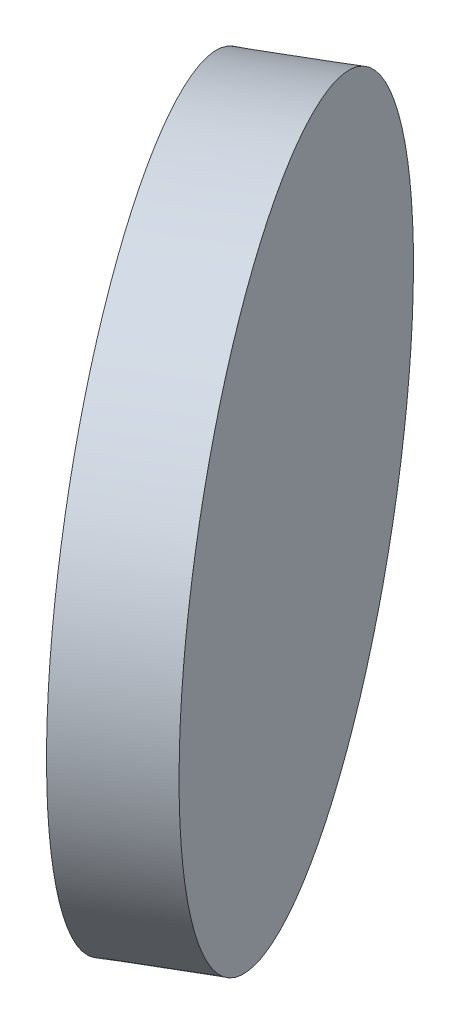
ISO-10303-21;
HEADER;
FILE_DESCRIPTION(('STEP AP214'),'2;1');
FILE_NAME('part.step','',(''),(''),'','','');
FILE_SCHEMA(('AUTOMOTIVE_DESIGN { 1 0 10303 214 1 1 1 1 }'));
ENDSEC;
DATA;
#1=APPLICATION_CONTEXT('core data for automotive mechanical design processes');
#2=APPLICATION_PROTOCOL_DEFINITION('international standard','automotive_design',2000,#1);
#3=PRODUCT_CONTEXT('',#1,'mechanical');
#4=PRODUCT('Part','Part','',(#3));
#5=PRODUCT_RELATED_PRODUCT_CATEGORY('part','',(#4));
#6=PRODUCT_DEFINITION_FORMATION('','',#4);
#7=PRODUCT_DEFINITION_CONTEXT('part definition',#1,'design');
#8=PRODUCT_DEFINITION('design','',#6,#7);
#9=PRODUCT_DEFINITION_SHAPE('','',#8);
#10=(LENGTH_UNIT() NAMED_UNIT(*) SI_UNIT(.MILLI.,.METRE.));
#11=(NAMED_UNIT(*) PLANE_ANGLE_UNIT() SI_UNIT($,.RADIAN.));
#12=(NAMED_UNIT(*) SI_UNIT($,.STERADIAN.) SOLID_ANGLE_UNIT());
#13=UNCERTAINTY_MEASURE_WITH_UNIT(LENGTH_MEASURE(1.E-05),#10,'distance_accuracy_value','');
#14=(GEOMETRIC_REPRESENTATION_CONTEXT(3) GLOBAL_UNCERTAINTY_ASSIGNED_CONTEXT((#13)) GLOBAL_UNIT_ASSIGNED_CONTEXT((#10,
#11,#12)) REPRESENTATION_CONTEXT('',''));
#15=CARTESIAN_POINT('',(0.,0.,0.));
#16=DIRECTION('',(0.,0.,1.));
#17=DIRECTION('',(1.,0.,0.));
#18=AXIS2_PLACEMENT_3D('',#15,#16,#17);
#19=CARTESIAN_POINT('',(145.810327838397,186.949261113837,104.208691892853));
#20=CARTESIAN_POINT('',(145.810327838397,187.314390039411,104.208691892853));
#21=CARTESIAN_POINT('',(145.846586216857,188.04464789056,104.270807986674));
#22=CARTESIAN_POINT('',(146.0076588362,189.097939567754,104.546749778892));
#23=CARTESIAN_POINT('',(146.269226576766,190.068658736957,104.994854934272));
#24=CARTESIAN_POINT('',(146.621237536975,190.919501204881,105.597903022993));
#25=CARTESIAN_POINT('',(147.050164133034,191.617769572643,106.332719245199));
#26=CARTESIAN_POINT('',(147.539522956403,192.136629778463,107.17106502556));
#27=CARTESIAN_POINT('',(148.070508221934,192.456142315611,108.080723205886));
#28=CARTESIAN_POINT('',(148.622714463654,192.564028496469,109.02673613245));
#29=CARTESIAN_POINT('',(149.174920705374,192.456142315611,109.972749059014));
#30=CARTESIAN_POINT('',(149.705905970905,192.136629778463,110.88240723934));
#31=CARTESIAN_POINT('',(150.195264794274,191.617769572643,111.720753019701));
#32=CARTESIAN_POINT('',(150.624191390333,190.919501204881,112.455569241907));
#33=CARTESIAN_POINT('',(150.976202350542,190.068658736957,113.058617330628));
#34=CARTESIAN_POINT('',(151.237770091108,189.097939567754,113.506722486008));
#35=CARTESIAN_POINT('',(151.398842710451,188.04464789056,113.782664278226));
#36=CARTESIAN_POINT('',(151.453230278141,186.949261113837,113.875838418958));
#37=CARTESIAN_POINT('',(151.398842710451,185.853874337113,113.782664278226));
#38=CARTESIAN_POINT('',(151.237770091108,184.800582659919,113.506722486008));
#39=CARTESIAN_POINT('',(150.976202350542,183.829863490717,113.058617330628));
#40=CARTESIAN_POINT('',(150.624191390334,182.979021022792,112.455569241907));
#41=CARTESIAN_POINT('',(150.195264794274,182.28075265503,111.720753019701));
#42=CARTESIAN_POINT('',(149.705905970906,181.761892449211,110.88240723934));
#43=CARTESIAN_POINT('',(149.174920705374,181.442379912062,109.972749059014));
#44=CARTESIAN_POINT('',(148.622714463654,181.334493731204,109.02673613245));
#45=CARTESIAN_POINT('',(148.070508221934,181.442379912062,108.080723205886));
#46=CARTESIAN_POINT('',(147.539522956403,181.76189244921,107.17106502556));
#47=CARTESIAN_POINT('',(147.050164133034,182.28075265503,106.332719245199));
#48=CARTESIAN_POINT('',(146.621237536975,182.979021022792,105.597903022993));
#49=CARTESIAN_POINT('',(146.269226576767,183.829863490717,104.994854934272));
#50=CARTESIAN_POINT('',(146.0076588362,184.800582659919,104.546749778892));
#51=CARTESIAN_POINT('',(145.846586216857,185.853874337113,104.270807986674));
#52=CARTESIAN_POINT('',(145.810327838397,186.584132188262,104.208691892853));
#53=CARTESIAN_POINT('',(145.810327838397,186.949261113837,104.208691892853));
#54=B_SPLINE_CURVE_WITH_KNOTS('',3,(#19,#20,#21,#22,#23,#24,#25,#26,#27,#28,#29,#30,#31,#32,#33,
#34,#35,#36,#37,#38,#39,#40,#41,#42,#43,#44,#45,#46,#47,#48,#49,#50,#51,#52,#53),.UNSPECIFIED.,
.T.,.F.,(4,1,1,1,1,1,1,1,1,1,1,1,1,1,1,1,1,1,1,1,1,1,1,1,1,1,1,1,1,1,1,1,4),(0.,
0.0312499999999999,0.0624999999999998,0.0937500000000001,0.125,0.15625,0.1875,0.21875,0.25,
0.28125,0.3125,0.34375,0.375000000000001,0.40625,0.4375,0.46875,0.5,0.53125,0.5625,0.59375,
0.625,0.65625,0.6875,0.71875,0.75,0.78125,0.8125,0.84375,0.875,0.90625,0.9375,0.96875,1.),.UNSPECIFIED.);
#55=DIRECTION('',(0.863633692378211,0.,-0.504119872043523));
#56=VECTOR('',#55,1.);
#57=SURFACE_OF_LINEAR_EXTRUSION('',#54,#56);
#58=CARTESIAN_POINT('',(145.810327838397,186.949261113837,104.208691892853));
#59=CARTESIAN_POINT('',(145.810327840195,187.022287191381,104.208691895933));
#60=CARTESIAN_POINT('',(145.811053011605,187.095312949708,104.20993422439));
#61=CARTESIAN_POINT('',(145.813948106546,187.24125221387,104.2148939605));
#62=CARTESIAN_POINT('',(145.816118039557,187.314165718966,104.218611384395));
#63=CARTESIAN_POINT('',(145.821897080213,187.459768147386,104.228511756305));
#64=CARTESIAN_POINT('',(145.825506192723,187.532457069951,104.234694712654));
#65=CARTESIAN_POINT('',(145.834158032156,187.677498197483,104.249516623969));
#66=CARTESIAN_POINT('',(145.839200754233,187.749850403589,104.258155570632));
#67=CARTESIAN_POINT('',(145.850714263807,187.894105963232,104.277879956313));
#68=CARTESIAN_POINT('',(145.857185041933,187.966009319711,104.288965379276));
#69=CARTESIAN_POINT('',(145.871549075666,188.109254761566,104.313573144567));
#70=CARTESIAN_POINT('',(145.879442331272,188.180596846942,104.327095486896));
#71=CARTESIAN_POINT('',(145.896634775725,188.32261164732,104.356548748128));
#72=CARTESIAN_POINT('',(145.905933973796,188.393284357928,104.372479682837));
#73=CARTESIAN_POINT('',(145.925921808813,188.533852608526,104.406721871481));
#74=CARTESIAN_POINT('',(145.936610450454,188.603748145888,104.425033133463));
#75=CARTESIAN_POINT('',(145.959360684517,188.742654163727,104.464007730053));
#76=CARTESIAN_POINT('',(145.971422272297,188.811664647194,104.48467105671));
#77=CARTESIAN_POINT('',(145.996901929596,188.948692739563,104.52832156869));
#78=CARTESIAN_POINT('',(146.010319990214,189.016710354977,104.551308738763));
#79=CARTESIAN_POINT('',(146.038496055928,189.151644611201,104.599578606742));
#80=CARTESIAN_POINT('',(146.053254061024,189.21856125201,104.624861304649));
#81=CARTESIAN_POINT('',(146.084083158025,189.351193940435,104.677676217037));
#82=CARTESIAN_POINT('',(146.100154258544,189.416909980168,104.705208446278));
#83=CARTESIAN_POINT('',(146.133582766889,189.547042120442,104.762476543994));
#84=CARTESIAN_POINT('',(146.150940179063,189.611458216587,104.792212419918));
#85=CARTESIAN_POINT('',(146.186914528949,189.738891037255,104.853841929774));
#86=CARTESIAN_POINT('',(146.205531462404,189.801907766507,104.885735556413));
#87=CARTESIAN_POINT('',(146.243998098506,189.926442480764,104.951634730028));
#88=CARTESIAN_POINT('',(146.263847793064,189.9879604756,104.985640263144));
#89=CARTESIAN_POINT('',(146.30475310035,190.109398097887,105.055717249847));
#90=CARTESIAN_POINT('',(146.325808713079,190.169317725339,105.091788703434));
#91=CARTESIAN_POINT('',(146.36908971772,190.287471302111,105.165935619515));
#92=CARTESIAN_POINT('',(146.391315117306,190.345705240368,105.204011095159));
#93=CARTESIAN_POINT('',(146.436899660151,190.460400365108,105.282104321067));
#94=CARTESIAN_POINT('',(146.460258807241,190.516861545599,105.322122077896));
#95=CARTESIAN_POINT('',(146.508074798859,190.627923997273,105.404038113518));
#96=CARTESIAN_POINT('',(146.532531639677,190.682525274743,105.445936385954));
#97=CARTESIAN_POINT('',(146.582507003329,190.789780811656,105.531551752918));
#98=CARTESIAN_POINT('',(146.608025519197,190.842435083872,105.575268835511));
#99=CARTESIAN_POINT('',(146.660088100036,190.945709292502,105.664459921637));
#100=CARTESIAN_POINT('',(146.686632165009,190.996329228916,105.709933925171));
#101=CARTESIAN_POINT('',(146.740701812553,191.095463118341,105.802563420544));
#102=CARTESIAN_POINT('',(146.768227401565,191.143977057532,105.849718923414));
#103=CARTESIAN_POINT('',(146.824216190492,191.238827497418,105.945636198637));
#104=CARTESIAN_POINT('',(146.852679393576,191.285163990751,105.99439797642));
#105=CARTESIAN_POINT('',(146.910499485184,191.375588005698,106.093452550498));
#106=CARTESIAN_POINT('',(146.939856370687,191.419675534913,106.143745341616));
#107=CARTESIAN_POINT('',(146.999419936691,191.505530124348,106.245786751392));
#108=CARTESIAN_POINT('',(147.029626611615,191.547297199793,106.297535360494));
#109=CARTESIAN_POINT('',(147.090845730223,191.628439224845,106.402412982623));
#110=CARTESIAN_POINT('',(147.121858173908,191.667814174452,106.455541995651));
#111=CARTESIAN_POINT('',(147.184638598124,191.744118716756,106.563094370754));
#112=CARTESIAN_POINT('',(147.216406583612,191.781048293404,106.61751774132));
#113=CARTESIAN_POINT('',(147.280648000861,191.852408999223,106.727573018764));
#114=CARTESIAN_POINT('',(147.313121435007,191.886840119947,106.783204929726));
#115=CARTESIAN_POINT('',(147.37872363291,191.953150753982,106.895591430527));
#116=CARTESIAN_POINT('',(147.411852394452,191.985030275918,106.952346016571));
#117=CARTESIAN_POINT('',(147.47871516837,192.046184574152,107.066892075005));
#118=CARTESIAN_POINT('',(147.512449176772,192.075459367539,107.124683540589));
#119=CARTESIAN_POINT('',(147.580472216754,192.131350966496,107.241217310519));
#120=CARTESIAN_POINT('',(147.614761248332,192.157967772064,107.299959614865));
#121=CARTESIAN_POINT('',(147.683839832725,192.208510626477,107.41830169224));
#122=CARTESIAN_POINT('',(147.718629388822,192.232436657663,107.477901470892));
#123=CARTESIAN_POINT('',(147.788654672756,192.27756527751,107.597865387963));
#124=CARTESIAN_POINT('',(147.823890402101,192.298767856963,107.658229528965));
#125=CARTESIAN_POINT('',(147.894753650624,192.338416829609,107.779629006291));
#126=CARTESIAN_POINT('',(147.930381168478,192.356863232117,107.840664340347));
#127=CARTESIAN_POINT('',(148.001973651404,192.390967113763,107.963313106653));
#128=CARTESIAN_POINT('',(148.037938614261,192.406624611201,108.024926535107));
#129=CARTESIAN_POINT('',(148.110151488336,192.435117901258,108.148638125412));
#130=CARTESIAN_POINT('',(148.146399399555,192.447953693877,108.210736287263));
#131=CARTESIAN_POINT('',(148.219121492866,192.470792526848,108.335320247242));
#132=CARTESIAN_POINT('',(148.255595676441,192.480795548612,108.397806047912));
#133=CARTESIAN_POINT('',(148.328713794669,192.497957814934,108.523068458553));
#134=CARTESIAN_POINT('',(148.365357729894,192.50511704988,108.585845069509));
#135=CARTESIAN_POINT('',(148.438758794137,192.516580673352,108.711592209528));
#136=CARTESIAN_POINT('',(148.475515922772,192.520885071528,108.774562737937));
#137=CARTESIAN_POINT('',(148.549086855738,192.526627943541,108.900600888807));
#138=CARTESIAN_POINT('',(148.585900659696,192.528066436183,108.963668510629));
#139=CARTESIAN_POINT('',(148.659528267612,192.528066436183,109.089803754272));
#140=CARTESIAN_POINT('',(148.69634207157,192.526627943541,109.152871376093));
#141=CARTESIAN_POINT('',(148.769913004536,192.520885071529,109.278909526963));
#142=CARTESIAN_POINT('',(148.806670133171,192.516580673352,109.341880055372));
#143=CARTESIAN_POINT('',(148.880071197414,192.50511704988,109.467627195392));
#144=CARTESIAN_POINT('',(148.916715132639,192.497957814934,109.530403806347));
#145=CARTESIAN_POINT('',(148.989833250867,192.480795548612,109.655666216989));
#146=CARTESIAN_POINT('',(149.026307434442,192.470792526848,109.718152017658));
#147=CARTESIAN_POINT('',(149.099029527753,192.447953693877,109.842735977637));
#148=CARTESIAN_POINT('',(149.135277438972,192.435117901258,109.904834139488));
#149=CARTESIAN_POINT('',(149.207490313047,192.406624611201,110.028545729794));
#150=CARTESIAN_POINT('',(149.243455275904,192.390967113763,110.090159158248));
#151=CARTESIAN_POINT('',(149.31504775883,192.356863232117,110.212807924553));
#152=CARTESIAN_POINT('',(149.350675276684,192.338416829609,110.273843258609));
#153=CARTESIAN_POINT('',(149.421538525207,192.298767856963,110.395242735935));
#154=CARTESIAN_POINT('',(149.456774254552,192.27756527751,110.455606876937));
#155=CARTESIAN_POINT('',(149.526799538486,192.232436657663,110.575570794008));
#156=CARTESIAN_POINT('',(149.561589094583,192.208510626477,110.635170572661));
#157=CARTESIAN_POINT('',(149.630667678976,192.157967772064,110.753512650035));
#158=CARTESIAN_POINT('',(149.664956710554,192.131350966496,110.812254954381));
#159=CARTESIAN_POINT('',(149.732979750536,192.075459367539,110.928788724311));
#160=CARTESIAN_POINT('',(149.766713758938,192.046184574152,110.986580189895));
#161=CARTESIAN_POINT('',(149.833576532856,191.985030275918,111.101126248329));
#162=CARTESIAN_POINT('',(149.866705294398,191.953150753982,111.157880834373));
#163=CARTESIAN_POINT('',(149.932307492301,191.886840119947,111.270267335175));
#164=CARTESIAN_POINT('',(149.964780926447,191.852408999223,111.325899246137));
#165=CARTESIAN_POINT('',(150.029022343696,191.781048293404,111.43595452358));
#166=CARTESIAN_POINT('',(150.060790329184,191.744118716756,111.490377894146));
#167=CARTESIAN_POINT('',(150.1235707534,191.667814174452,111.597930269249));
#168=CARTESIAN_POINT('',(150.154583197085,191.628439224845,111.651059282277));
#169=CARTESIAN_POINT('',(150.215802315694,191.547297199793,111.755936904407));
#170=CARTESIAN_POINT('',(150.246008990617,191.505530124348,111.807685513508));
#171=CARTESIAN_POINT('',(150.305572556621,191.419675534913,111.909726923284));
#172=CARTESIAN_POINT('',(150.334929442124,191.375588005698,111.960019714402));
#173=CARTESIAN_POINT('',(150.392749533732,191.285163990751,112.05907428848));
#174=CARTESIAN_POINT('',(150.421212736816,191.238827497418,112.107836066263));
#175=CARTESIAN_POINT('',(150.477201525743,191.143977057532,112.203753341487));
#176=CARTESIAN_POINT('',(150.504727114755,191.095463118341,112.250908844357));
#177=CARTESIAN_POINT('',(150.558796762299,190.996329228916,112.343538339729));
#178=CARTESIAN_POINT('',(150.585340827272,190.945709292502,112.389012343263));
#179=CARTESIAN_POINT('',(150.637403408112,190.842435083872,112.478203429389));
#180=CARTESIAN_POINT('',(150.662921923979,190.789780811656,112.521920511982));
#181=CARTESIAN_POINT('',(150.712897287632,190.682525274743,112.607535878946));
#182=CARTESIAN_POINT('',(150.737354128449,190.627923997273,112.649434151382));
#183=CARTESIAN_POINT('',(150.785170120067,190.516861545599,112.731350187004));
#184=CARTESIAN_POINT('',(150.808529267157,190.460400365108,112.771367943833));
#185=CARTESIAN_POINT('',(150.854113810002,190.345705240368,112.849461169741));
#186=CARTESIAN_POINT('',(150.876339209589,190.287471302111,112.887536645385));
#187=CARTESIAN_POINT('',(150.919620214229,190.169317725339,112.961683561467));
#188=CARTESIAN_POINT('',(150.940675826958,190.109398097887,112.997755015053));
#189=CARTESIAN_POINT('',(150.981581134245,189.9879604756,113.067832001756));
#190=CARTESIAN_POINT('',(151.001430828802,189.926442480764,113.101837534872));
#191=CARTESIAN_POINT('',(151.039897464905,189.801907766507,113.167736708487));
#192=CARTESIAN_POINT('',(151.058514398359,189.738891037255,113.199630335126));
#193=CARTESIAN_POINT('',(151.094488748245,189.611458216587,113.261259844983));
#194=CARTESIAN_POINT('',(151.111846160419,189.547042120442,113.290995720906));
#195=CARTESIAN_POINT('',(151.145274668764,189.416909980168,113.348263818622));
#196=CARTESIAN_POINT('',(151.161345769284,189.351193940435,113.375796047863));
#197=CARTESIAN_POINT('',(151.192174866284,189.21856125201,113.428610960251));
#198=CARTESIAN_POINT('',(151.20693287138,189.1516446112,113.453893658158));
#199=CARTESIAN_POINT('',(151.235108937095,189.016710354977,113.502163526138));
#200=CARTESIAN_POINT('',(151.248526997712,188.948692739564,113.52515069621));
#201=CARTESIAN_POINT('',(151.274006655011,188.811664647193,113.56880120819));
#202=CARTESIAN_POINT('',(151.286068242791,188.742654163722,113.589464534847));
#203=CARTESIAN_POINT('',(151.308818476854,188.603748145893,113.628439131437));
#204=CARTESIAN_POINT('',(151.319507118495,188.533852608544,113.646750393419));
#205=CARTESIAN_POINT('',(151.339494953512,188.393284357909,113.680992582064));
#206=CARTESIAN_POINT('',(151.348794151584,188.322611647252,113.696923516773));
#207=CARTESIAN_POINT('',(151.365986596036,188.18059684701,113.726376778003));
#208=CARTESIAN_POINT('',(151.37387985164,188.10925476182,113.739899120329));
#209=CARTESIAN_POINT('',(151.388243885378,187.966009319456,113.764506885629));
#210=CARTESIAN_POINT('',(151.394714663511,187.894105962282,113.775592308603));
#211=CARTESIAN_POINT('',(151.406228173066,187.749850404539,113.795316694252));
#212=CARTESIAN_POINT('',(151.411270895117,187.677498201029,113.803955640872));
#213=CARTESIAN_POINT('',(151.41992273462,187.532457066405,113.818777552305));
#214=CARTESIAN_POINT('',(151.423531847224,187.459768134154,113.824960508816));
#215=CARTESIAN_POINT('',(151.429310887622,187.314165732198,113.834860880284));
#216=CARTESIAN_POINT('',(151.43148082028,187.241252263254,113.838578303574));
#217=CARTESIAN_POINT('',(151.434375916185,187.095312900325,113.843538041336));
#218=CARTESIAN_POINT('',(151.435101088911,187.022287007081,113.844780372047));
#219=CARTESIAN_POINT('',(151.435101088911,186.876235220593,113.844780372047));
#220=CARTESIAN_POINT('',(151.434375916185,186.803209327349,113.843538041336));
#221=CARTESIAN_POINT('',(151.43148082028,186.657269964419,113.838578303574));
#222=CARTESIAN_POINT('',(151.429310887622,186.584356495475,113.834860880284));
#223=CARTESIAN_POINT('',(151.423531847224,186.438754093519,113.824960508816));
#224=CARTESIAN_POINT('',(151.41992273462,186.366065161268,113.818777552305));
#225=CARTESIAN_POINT('',(151.411270895117,186.221024026644,113.803955640872));
#226=CARTESIAN_POINT('',(151.406228173066,186.148671823134,113.795316694252));
#227=CARTESIAN_POINT('',(151.394714663511,186.004416265391,113.775592308603));
#228=CARTESIAN_POINT('',(151.388243885378,185.932512908217,113.764506885629));
#229=CARTESIAN_POINT('',(151.37387985164,185.789267465853,113.739899120329));
#230=CARTESIAN_POINT('',(151.365986596036,185.717925380663,113.726376778003));
#231=CARTESIAN_POINT('',(151.348794151584,185.575910580421,113.696923516773));
#232=CARTESIAN_POINT('',(151.339494953512,185.505237869764,113.680992582064));
#233=CARTESIAN_POINT('',(151.319507118495,185.364669619129,113.646750393419));
#234=CARTESIAN_POINT('',(151.308818476854,185.29477408178,113.628439131437));
#235=CARTESIAN_POINT('',(151.286068242791,185.155868063951,113.589464534847));
#236=CARTESIAN_POINT('',(151.274006655011,185.086857580481,113.56880120819));
#237=CARTESIAN_POINT('',(151.248526997712,184.949829488109,113.52515069621));
#238=CARTESIAN_POINT('',(151.235108937095,184.881811872696,113.502163526138));
#239=CARTESIAN_POINT('',(151.20693287138,184.746877616473,113.453893658158));
#240=CARTESIAN_POINT('',(151.192174866284,184.679960975663,113.428610960251));
#241=CARTESIAN_POINT('',(151.161345769284,184.547328287238,113.375796047863));
#242=CARTESIAN_POINT('',(151.145274668764,184.481612247505,113.348263818622));
#243=CARTESIAN_POINT('',(151.111846160419,184.351480107231,113.290995720906));
#244=CARTESIAN_POINT('',(151.094488748246,184.287064011087,113.261259844983));
#245=CARTESIAN_POINT('',(151.058514398359,184.159631190419,113.199630335126));
#246=CARTESIAN_POINT('',(151.039897464905,184.096614461166,113.167736708487));
#247=CARTESIAN_POINT('',(151.001430828802,183.972079746909,113.101837534872));
#248=CARTESIAN_POINT('',(150.981581134245,183.910561752073,113.067832001756));
#249=CARTESIAN_POINT('',(150.940675826958,183.789124129786,112.997755015053));
#250=CARTESIAN_POINT('',(150.919620214229,183.729204502335,112.961683561467));
#251=CARTESIAN_POINT('',(150.876339209589,183.611050925562,112.887536645385));
#252=CARTESIAN_POINT('',(150.854113810002,183.552816987305,112.849461169741));
#253=CARTESIAN_POINT('',(150.808529267158,183.438121862565,112.771367943833));
#254=CARTESIAN_POINT('',(150.785170120067,183.381660682075,112.731350187004));
#255=CARTESIAN_POINT('',(150.737354128449,183.270598230401,112.649434151382));
#256=CARTESIAN_POINT('',(150.712897287632,183.215996952931,112.607535878946));
#257=CARTESIAN_POINT('',(150.662921923979,183.108741416018,112.521920511982));
#258=CARTESIAN_POINT('',(150.637403408112,183.056087143801,112.478203429389));
#259=CARTESIAN_POINT('',(150.585340827272,182.952812935171,112.389012343263));
#260=CARTESIAN_POINT('',(150.558796762299,182.902192998757,112.343538339729));
#261=CARTESIAN_POINT('',(150.504727114755,182.803059109332,112.250908844357));
#262=CARTESIAN_POINT('',(150.477201525743,182.754545170141,112.203753341487));
#263=CARTESIAN_POINT('',(150.421212736816,182.659694730255,112.107836066263));
#264=CARTESIAN_POINT('',(150.392749533732,182.613358236922,112.05907428848));
#265=CARTESIAN_POINT('',(150.334929442124,182.522934221975,111.960019714402));
#266=CARTESIAN_POINT('',(150.305572556621,182.47884669276,111.909726923284));
#267=CARTESIAN_POINT('',(150.246008990617,182.392992103325,111.807685513508));
#268=CARTESIAN_POINT('',(150.215802315694,182.35122502788,111.755936904407));
#269=CARTESIAN_POINT('',(150.154583197085,182.270083002828,111.651059282277));
#270=CARTESIAN_POINT('',(150.1235707534,182.230708053221,111.597930269249));
#271=CARTESIAN_POINT('',(150.060790329184,182.154403510917,111.490377894146));
#272=CARTESIAN_POINT('',(150.029022343696,182.117473934269,111.43595452358));
#273=CARTESIAN_POINT('',(149.964780926447,182.04611322845,111.325899246137));
#274=CARTESIAN_POINT('',(149.932307492301,182.011682107727,111.270267335175));
#275=CARTESIAN_POINT('',(149.866705294398,181.945371473691,111.157880834373));
#276=CARTESIAN_POINT('',(149.833576532856,181.913491951755,111.101126248329));
#277=CARTESIAN_POINT('',(149.766713758939,181.852337653521,110.986580189895));
#278=CARTESIAN_POINT('',(149.732979750536,181.823062860134,110.928788724311));
#279=CARTESIAN_POINT('',(149.664956710554,181.767171261178,110.812254954381));
#280=CARTESIAN_POINT('',(149.630667678976,181.740554455609,110.753512650035));
#281=CARTESIAN_POINT('',(149.561589094583,181.690011601196,110.635170572661));
#282=CARTESIAN_POINT('',(149.526799538486,181.66608557001,110.575570794008));
#283=CARTESIAN_POINT('',(149.456774254552,181.620956950164,110.455606876937));
#284=CARTESIAN_POINT('',(149.421538525207,181.59975437071,110.395242735935));
#285=CARTESIAN_POINT('',(149.350675276684,181.560105398064,110.273843258609));
#286=CARTESIAN_POINT('',(149.31504775883,181.541658995556,110.212807924553));
#287=CARTESIAN_POINT('',(149.243455275904,181.50755511391,110.090159158248));
#288=CARTESIAN_POINT('',(149.207490313047,181.491897616473,110.028545729794));
#289=CARTESIAN_POINT('',(149.135277438972,181.463404326416,109.904834139488));
#290=CARTESIAN_POINT('',(149.099029527753,181.450568533796,109.842735977637));
#291=CARTESIAN_POINT('',(149.026307434443,181.427729700825,109.718152017658));
#292=CARTESIAN_POINT('',(148.989833250867,181.417726679062,109.655666216989));
#293=CARTESIAN_POINT('',(148.916715132639,181.400564412739,109.530403806347));
#294=CARTESIAN_POINT('',(148.880071197414,181.393405177794,109.467627195392));
#295=CARTESIAN_POINT('',(148.806670133171,181.381941554321,109.341880055372));
#296=CARTESIAN_POINT('',(148.769913004536,181.377637156145,109.278909526963));
#297=CARTESIAN_POINT('',(148.69634207157,181.371894284132,109.152871376093));
#298=CARTESIAN_POINT('',(148.659528267612,181.37045579149,109.089803754272));
#299=CARTESIAN_POINT('',(148.585900659696,181.37045579149,108.963668510629));
#300=CARTESIAN_POINT('',(148.549086855738,181.371894284132,108.900600888807));
#301=CARTESIAN_POINT('',(148.475515922772,181.377637156145,108.774562737937));
#302=CARTESIAN_POINT('',(148.438758794138,181.381941554321,108.711592209528));
#303=CARTESIAN_POINT('',(148.365357729895,181.393405177794,108.585845069509));
#304=CARTESIAN_POINT('',(148.328713794669,181.400564412739,108.523068458553));
#305=CARTESIAN_POINT('',(148.255595676442,181.417726679062,108.397806047911));
#306=CARTESIAN_POINT('',(148.219121492866,181.427729700825,108.335320247242));
#307=CARTESIAN_POINT('',(148.146399399555,181.450568533796,108.210736287263));
#308=CARTESIAN_POINT('',(148.110151488337,181.463404326416,108.148638125412));
#309=CARTESIAN_POINT('',(148.037938614261,181.491897616473,108.024926535106));
#310=CARTESIAN_POINT('',(148.001973651404,181.50755511391,107.963313106652));
#311=CARTESIAN_POINT('',(147.930381168478,181.541658995556,107.840664340347));
#312=CARTESIAN_POINT('',(147.894753650624,181.560105398064,107.779629006291));
#313=CARTESIAN_POINT('',(147.823890402101,181.59975437071,107.658229528965));
#314=CARTESIAN_POINT('',(147.788654672756,181.620956950164,107.597865387963));
#315=CARTESIAN_POINT('',(147.718629388822,181.66608557001,107.477901470892));
#316=CARTESIAN_POINT('',(147.683839832725,181.690011601196,107.418301692239));
#317=CARTESIAN_POINT('',(147.614761248333,181.740554455609,107.299959614865));
#318=CARTESIAN_POINT('',(147.580472216754,181.767171261178,107.241217310519));
#319=CARTESIAN_POINT('',(147.512449176772,181.823062860134,107.124683540589));
#320=CARTESIAN_POINT('',(147.47871516837,181.852337653521,107.066892075005));
#321=CARTESIAN_POINT('',(147.411852394452,181.913491951755,106.952346016571));
#322=CARTESIAN_POINT('',(147.378723632911,181.945371473691,106.895591430527));
#323=CARTESIAN_POINT('',(147.313121435007,182.011682107726,106.783204929726));
#324=CARTESIAN_POINT('',(147.280648000861,182.04611322845,106.727573018763));
#325=CARTESIAN_POINT('',(147.216406583612,182.117473934269,106.61751774132));
#326=CARTESIAN_POINT('',(147.184638598124,182.154403510917,106.563094370754));
#327=CARTESIAN_POINT('',(147.121858173908,182.230708053221,106.455541995651));
#328=CARTESIAN_POINT('',(147.090845730223,182.270083002828,106.402412982623));
#329=CARTESIAN_POINT('',(147.029626611615,182.35122502788,106.297535360493));
#330=CARTESIAN_POINT('',(146.999419936691,182.392992103325,106.245786751392));
#331=CARTESIAN_POINT('',(146.939856370687,182.47884669276,106.143745341616));
#332=CARTESIAN_POINT('',(146.910499485184,182.522934221975,106.093452550498));
#333=CARTESIAN_POINT('',(146.852679393576,182.613358236922,105.99439797642));
#334=CARTESIAN_POINT('',(146.824216190492,182.659694730255,105.945636198637));
#335=CARTESIAN_POINT('',(146.768227401565,182.754545170141,105.849718923413));
#336=CARTESIAN_POINT('',(146.740701812554,182.803059109332,105.802563420544));
#337=CARTESIAN_POINT('',(146.686632165009,182.902192998757,105.709933925171));
#338=CARTESIAN_POINT('',(146.660088100037,182.952812935171,105.664459921637));
#339=CARTESIAN_POINT('',(146.608025519197,183.056087143801,105.575268835511));
#340=CARTESIAN_POINT('',(146.582507003329,183.108741416018,105.531551752918));
#341=CARTESIAN_POINT('',(146.532531639677,183.215996952931,105.445936385954));
#342=CARTESIAN_POINT('',(146.508074798859,183.270598230401,105.404038113518));
#343=CARTESIAN_POINT('',(146.460258807241,183.381660682075,105.322122077896));
#344=CARTESIAN_POINT('',(146.436899660151,183.438121862565,105.282104321067));
#345=CARTESIAN_POINT('',(146.391315117306,183.552816987305,105.204011095159));
#346=CARTESIAN_POINT('',(146.36908971772,183.611050925562,105.165935619515));
#347=CARTESIAN_POINT('',(146.325808713079,183.729204502335,105.091788703434));
#348=CARTESIAN_POINT('',(146.30475310035,183.789124129786,105.055717249847));
#349=CARTESIAN_POINT('',(146.263847793064,183.910561752073,104.985640263144));
#350=CARTESIAN_POINT('',(146.243998098506,183.972079746909,104.951634730028));
#351=CARTESIAN_POINT('',(146.205531462404,184.096614461166,104.885735556413));
#352=CARTESIAN_POINT('',(146.186914528949,184.159631190419,104.853841929774));
#353=CARTESIAN_POINT('',(146.150940179063,184.287064011087,104.792212419917));
#354=CARTESIAN_POINT('',(146.133582766889,184.351480107231,104.762476543994));
#355=CARTESIAN_POINT('',(146.100154258544,184.481612247505,104.705208446278));
#356=CARTESIAN_POINT('',(146.084083158025,184.547328287238,104.677676217037));
#357=CARTESIAN_POINT('',(146.053254061024,184.679960975663,104.624861304649));
#358=CARTESIAN_POINT('',(146.038496055928,184.746877616473,104.599578606742));
#359=CARTESIAN_POINT('',(146.010319990214,184.881811872696,104.551308738762));
#360=CARTESIAN_POINT('',(145.996901929596,184.94982948811,104.52832156869));
#361=CARTESIAN_POINT('',(145.971422272297,185.086857580479,104.48467105671));
#362=CARTESIAN_POINT('',(145.959360684517,185.155868063946,104.464007730053));
#363=CARTESIAN_POINT('',(145.936610450454,185.294774081785,104.425033133463));
#364=CARTESIAN_POINT('',(145.925921808813,185.364669619147,104.406721871481));
#365=CARTESIAN_POINT('',(145.905933973796,185.505237869745,104.372479682837));
#366=CARTESIAN_POINT('',(145.896634775725,185.575910580353,104.356548748128));
#367=CARTESIAN_POINT('',(145.879442331272,185.717925380732,104.327095486896));
#368=CARTESIAN_POINT('',(145.871549075666,185.789267466107,104.313573144567));
#369=CARTESIAN_POINT('',(145.857185041933,185.932512907962,104.288965379276));
#370=CARTESIAN_POINT('',(145.850714263807,186.004416264441,104.277879956313));
#371=CARTESIAN_POINT('',(145.839200754233,186.148671824084,104.258155570632));
#372=CARTESIAN_POINT('',(145.834158032156,186.22102403019,104.249516623969));
#373=CARTESIAN_POINT('',(145.825506192723,186.366065157723,104.234694712654));
#374=CARTESIAN_POINT('',(145.821897080213,186.438754080287,104.228511756305));
#375=CARTESIAN_POINT('',(145.816118039557,186.584356508707,104.218611384395));
#376=CARTESIAN_POINT('',(145.813948106546,186.657270013803,104.2148939605));
#377=CARTESIAN_POINT('',(145.811053011605,186.803209277965,104.20993422439));
#378=CARTESIAN_POINT('',(145.810327840195,186.876235036292,104.208691895933));
#379=CARTESIAN_POINT('',(145.810327838397,186.949261113837,104.208691892853));
#380=B_SPLINE_CURVE_WITH_KNOTS('',3,(#58,#59,#60,#61,#62,#63,#64,#65,#66,#67,#68,#69,#70,#71,
#72,#73,#74,#75,#76,#77,#78,#79,#80,#81,#82,#83,#84,#85,#86,#87,#88,#89,#90,#91,#92,#93,#94,#95,
#96,#97,#98,#99,#100,#101,#102,#103,#104,#105,#106,#107,#108,#109,#110,#111,#112,#113,#114,#115,
#116,#117,#118,#119,#120,#121,#122,#123,#124,#125,#126,#127,#128,#129,#130,#131,#132,#133,#134,
#135,#136,#137,#138,#139,#140,#141,#142,#143,#144,#145,#146,#147,#148,#149,#150,#151,#152,#153,
#154,#155,#156,#157,#158,#159,#160,#161,#162,#163,#164,#165,#166,#167,#168,#169,#170,#171,#172,
#173,#174,#175,#176,#177,#178,#179,#180,#181,#182,#183,#184,#185,#186,#187,#188,#189,#190,#191,
#192,#193,#194,#195,#196,#197,#198,#199,#200,#201,#202,#203,#204,#205,#206,#207,#208,#209,#210,
#211,#212,#213,#214,#215,#216,#217,#218,#219,#220,#221,#222,#223,#224,#225,#226,#227,#228,#229,
#230,#231,#232,#233,#234,#235,#236,#237,#238,#239,#240,#241,#242,#243,#244,#245,#246,#247,#248,
#249,#250,#251,#252,#253,#254,#255,#256,#257,#258,#259,#260,#261,#262,#263,#264,#265,#266,#267,
#268,#269,#270,#271,#272,#273,#274,#275,#276,#277,#278,#279,#280,#281,#282,#283,#284,#285,#286,
#287,#288,#289,#290,#291,#292,#293,#294,#295,#296,#297,#298,#299,#300,#301,#302,#303,#304,#305,
#306,#307,#308,#309,#310,#311,#312,#313,#314,#315,#316,#317,#318,#319,#320,#321,#322,#323,#324,
#325,#326,#327,#328,#329,#330,#331,#332,#333,#334,#335,#336,#337,#338,#339,#340,#341,#342,#343,
#344,#345,#346,#347,#348,#349,#350,#351,#352,#353,#354,#355,#356,#357,#358,#359,#360,#361,#362,
#363,#364,#365,#366,#367,#368,#369,#370,#371,#372,#373,#374,#375,#376,#377,#378,#379),
.UNSPECIFIED.,.F.,.F.,(4,2,2,2,2,2,2,2,2,2,2,2,2,2,2,2,2,2,2,2,2,2,2,2,2,2,2,2,2,2,2,2,2,2,2,2,
2,2,2,2,2,2,2,2,2,2,2,2,2,2,2,2,2,2,2,2,2,2,2,2,2,2,2,2,2,2,2,2,2,2,2,2,2,2,2,2,2,2,2,2,2,2,2,2,
2,2,2,2,2,2,2,2,2,2,2,2,2,2,2,2,2,2,2,2,2,2,2,2,2,2,2,2,2,2,2,2,2,2,2,2,2,2,2,2,2,2,2,2,2,2,2,2,
2,2,2,2,2,2,2,2,2,2,2,2,2,2,2,2,2,2,2,2,2,2,2,2,2,2,2,2,4),(0.,0.219063629928075,
0.438128697318993,0.657194505217391,0.876259572608298,1.09532320253636,1.31438683246437,
1.53345189985528,1.75251770775365,1.9715827751445,2.19064640507254,2.4097100350006,
2.62877510239148,2.8478409102899,3.06690597768081,3.28596960760884,3.50503323753685,
3.72409830492775,3.94316411282615,4.16222918021703,4.38129281014507,4.60035644007309,
4.81942150746399,5.03848731536241,5.25755238275332,5.47661601268136,5.69567964260939,
5.91474471000031,6.13381051789867,6.35287558528958,6.57193921521761,6.79100284514559,
7.01006791253651,7.22913372043495,7.44819878782585,7.66726241775386,7.88632604768191,
8.10539111507281,8.3244569229712,8.54352199036211,8.76258562029014,8.98164925021816,
9.20071431760908,9.41978012550749,9.63884519289843,9.85790882282645,10.0769724527545,
10.2960375201454,10.5151033280438,10.7341683954347,10.9532320253627,11.1722956552907,
11.3913607226816,11.61042653058,11.8294915979709,12.048555227899,12.267618857827,
12.4866839252179,12.7057497331163,12.9248148005072,13.1438784304353,13.3629420603633,
13.5820071277542,13.8010729356526,14.0201380030435,14.2392016329715,14.4582652628995,
14.6773303302905,14.8963961381889,15.1154612055797,15.3345248355078,15.5535884654358,
15.7726535328267,15.9917193407251,16.210784408116,16.429848038044,16.6489116679721,
16.867976735363,17.0870425432614,17.3061076106523,17.5251712405803,17.7442348705084,
17.9632999378993,18.1823657457977,18.4014308131886,18.6204944431166,18.8395580730446,
19.0586231404356,19.2776889483339,19.4967540157248,19.7158176456529,19.9348812755809,
20.1539463429718,20.3730121508702,20.5920772182611,20.8111408481891,21.0302044781171,
21.2492695455081,21.4683353534065,21.6874004207974,21.9064640507254,22.1255276806534,
22.3445927480444,22.5636585559428,22.7827236233337,23.0017872532617,23.2208508831897,
23.4399159505806,23.658981758479,23.8780468258699,24.097110455798,24.316174085726,
24.5352391531169,24.7543049610153,24.9733700284062,25.1924336583342,25.4114972882623,
25.6305623556532,25.8496281635516,26.0686932309425,26.2877568608705,26.5068204907985,
26.7258855581894,26.9449513660878,27.1640164334788,27.3830800634068,27.6021436933348,
27.8212087607257,28.0402745686242,28.259339636015,28.4784032659431,28.6974668958711,
28.916531963262,29.1355977711604,29.3546628385513,29.5737264684794,29.7927900984074,
30.0118551657983,30.2309209736967,30.4499860410876,30.6690496710156,30.8881133009436,
31.1071783683345,31.3262441762329,31.5453092436239,31.7643728735519,31.9834365034799,
32.2025015708708,32.4215673787692,32.6406324461601,32.8596960760881,33.0787597060162,
33.2978247734071,33.5168905813055,33.7359556486964,33.9550192786244,34.1740829085525,
34.3931479759434,34.6122137838418,34.8312788512327,35.0503424811607),.UNSPECIFIED.);
#381=CARTESIAN_POINT('',(145.810327838397,186.949261113837,104.208691892853));
#382=VERTEX_POINT('',#381);
#383=EDGE_CURVE('E9',#382,#382,#380,.T.);
#384=ORIENTED_EDGE('',*,*,#383,.T.);
#385=EDGE_LOOP('',(#384));
#386=FACE_BOUND('',#385,.T.);
#387=CARTESIAN_POINT('',(147.242493100423,186.949261113837,103.372709027653));
#388=CARTESIAN_POINT('',(147.242493129967,186.860744505387,103.372709078266));
#389=CARTESIAN_POINT('',(147.243558566925,186.772228486568,103.37453433314));
#390=CARTESIAN_POINT('',(147.247810386015,186.595396358434,103.381818343201));
#391=CARTESIAN_POINT('',(147.25099678435,186.507080250652,103.387277126146));
#392=CARTESIAN_POINT('',(147.259480658916,186.330847977824,103.401811288204));
#393=CARTESIAN_POINT('',(147.264778136478,186.242931813031,103.410886669598));
#394=CARTESIAN_POINT('',(147.277473973934,186.06769881965,103.432636562012));
#395=CARTESIAN_POINT('',(147.2848723184,185.980381986665,103.445311046598));
#396=CARTESIAN_POINT('',(147.301761197596,185.80654826969,103.47424425457));
#397=CARTESIAN_POINT('',(147.311251728726,185.720031384322,103.490502971785));
#398=CARTESIAN_POINT('',(147.332297314,185.547990916216,103.526557246823));
#399=CARTESIAN_POINT('',(147.343852383991,185.462467341108,103.546352831792));
#400=CARTESIAN_POINT('',(147.368997321515,185.292605320213,103.589429918102));
#401=CARTESIAN_POINT('',(147.382587192866,185.208266876651,103.612711425983));
#402=CARTESIAN_POINT('',(147.411772058208,185.040966771312,103.662709520514));
#403=CARTESIAN_POINT('',(147.427367038518,184.958005100146,103.689426083725));
#404=CARTESIAN_POINT('',(147.460534496425,184.793652280549,103.746246962502));
#405=CARTESIAN_POINT('',(147.478106967416,184.712261126874,103.776351266753));
#406=CARTESIAN_POINT('',(147.515185455789,184.551230201978,103.839872333065));
#407=CARTESIAN_POINT('',(147.534691487509,184.47159044375,103.87328911969));
#408=CARTESIAN_POINT('',(147.575588552174,184.314238534528,103.943351985535));
#409=CARTESIAN_POINT('',(147.596979590921,184.236526389466,103.979998074691));
#410=CARTESIAN_POINT('',(147.641598800927,184.083206260673,104.056437539242));
#411=CARTESIAN_POINT('',(147.66482696097,184.007598264098,104.096230895422));
#412=CARTESIAN_POINT('',(147.713074441511,183.858665859671,104.178886136919));
#413=CARTESIAN_POINT('',(147.738093753462,183.785341440925,104.221748007595));
#414=CARTESIAN_POINT('',(147.789864917168,183.641139661153,104.310439852034));
#415=CARTESIAN_POINT('',(147.816616780775,183.570262316873,104.356269846101));
#416=CARTESIAN_POINT('',(147.871787630205,183.431108156205,104.450785867088));
#417=CARTESIAN_POINT('',(147.900206623034,183.362831350745,104.499471906007));
#418=CARTESIAN_POINT('',(147.958647557857,183.229033120811,104.599590078541));
#419=CARTESIAN_POINT('',(147.988669491481,183.16351168195,104.651022197815));
#420=CARTESIAN_POINT('',(148.050253474801,183.035382054965,104.756524888456));
#421=CARTESIAN_POINT('',(148.081815515328,182.9727738495,104.810595444115));
#422=CARTESIAN_POINT('',(148.146408206489,182.850612461435,104.921252506971));
#423=CARTESIAN_POINT('',(148.179438865863,182.791059297023,104.977839029144));
#424=CARTESIAN_POINT('',(148.246889212418,182.675132633418,105.093391688496));
#425=CARTESIAN_POINT('',(148.28130890685,182.61875915083,105.152357838099));
#426=CARTESIAN_POINT('',(148.35145928452,182.509319209081,105.272536059687));
#427=CARTESIAN_POINT('',(148.387189962249,182.456252736025,105.333748122233));
#428=CARTESIAN_POINT('',(148.459884945016,182.353556598506,105.458285637745));
#429=CARTESIAN_POINT('',(148.496849241612,182.303926910532,105.521611076248));
#430=CARTESIAN_POINT('',(148.571929026275,182.208220545407,105.650234118598));
#431=CARTESIAN_POINT('',(148.610044519834,182.162143885209,105.715531731853));
#432=CARTESIAN_POINT('',(148.687336243543,182.073634757755,105.847944160799));
#433=CARTESIAN_POINT('',(148.726512480168,182.031202312751,105.915058987582));
#434=CARTESIAN_POINT('',(148.80583670451,181.950076638216,106.050953397945));
#435=CARTESIAN_POINT('',(148.845984689237,181.911383397182,106.119732976402));
#436=CARTESIAN_POINT('',(148.927163578493,181.837832461324,106.258804708662));
#437=CARTESIAN_POINT('',(148.968194476472,181.802974738059,106.329096851242));
#438=CARTESIAN_POINT('',(149.051047998848,181.737181938084,106.471037483668));
#439=CARTESIAN_POINT('',(149.092870625889,181.706246874476,106.542685978042));
#440=CARTESIAN_POINT('',(149.177209933619,181.64835416489,106.687171985809));
#441=CARTESIAN_POINT('',(149.219726619042,181.621396546052,106.760009507312));
#442=CARTESIAN_POINT('',(149.305357439154,181.571517660302,106.906708071394));
#443=CARTESIAN_POINT('',(149.348471572721,181.548596385817,106.980569112053));
#444=CARTESIAN_POINT('',(149.435200591962,181.506849201222,107.129149057574));
#445=CARTESIAN_POINT('',(149.478815473791,181.48802325968,107.203867955847));
#446=CARTESIAN_POINT('',(149.56644850318,181.454521547432,107.353996607667));
#447=CARTESIAN_POINT('',(149.610466651435,181.43984578387,107.429406362404));
#448=CARTESIAN_POINT('',(149.698805092239,181.414661617766,107.580743490816));
#449=CARTESIAN_POINT('',(149.743125387005,181.404153245833,107.656670868288));
#450=CARTESIAN_POINT('',(149.83196755319,181.387324172443,107.80887095457));
#451=CARTESIAN_POINT('',(149.876489424482,181.381003468347,107.88514366316));
#452=CARTESIAN_POINT('',(149.965634106258,181.372569293941,108.037862004468));
#453=CARTESIAN_POINT('',(150.010256915969,181.37045579149,108.114307635859));
#454=CARTESIAN_POINT('',(150.099502535392,181.37045579149,108.267198898641));
#455=CARTESIAN_POINT('',(150.144125345103,181.372569293941,108.343644530032));
#456=CARTESIAN_POINT('',(150.233270026879,181.381003468347,108.496362871339));
#457=CARTESIAN_POINT('',(150.277791898171,181.387324172443,108.57263557993));
#458=CARTESIAN_POINT('',(150.366634064356,181.404153245833,108.724835666211));
#459=CARTESIAN_POINT('',(150.410954359122,181.414661617766,108.800763043684));
#460=CARTESIAN_POINT('',(150.499292799926,181.43984578387,108.952100172096));
#461=CARTESIAN_POINT('',(150.54331094818,181.454521547432,109.027509926832));
#462=CARTESIAN_POINT('',(150.63094397757,181.48802325968,109.177638578653));
#463=CARTESIAN_POINT('',(150.674558859398,181.506849201222,109.252357476926));
#464=CARTESIAN_POINT('',(150.76128787864,181.548596385817,109.400937422446));
#465=CARTESIAN_POINT('',(150.804402012207,181.571517660302,109.474798463105));
#466=CARTESIAN_POINT('',(150.890032832319,181.621396546052,109.621497027188));
#467=CARTESIAN_POINT('',(150.932549517742,181.64835416489,109.694334548691));
#468=CARTESIAN_POINT('',(151.016888825472,181.706246874476,109.838820556458));
#469=CARTESIAN_POINT('',(151.058711452513,181.737181938084,109.910469050832));
#470=CARTESIAN_POINT('',(151.141564974889,181.802974738059,110.052409683257));
#471=CARTESIAN_POINT('',(151.182595872868,181.837832461324,110.122701825838));
#472=CARTESIAN_POINT('',(151.263774762124,181.911383397182,110.261773558097));
#473=CARTESIAN_POINT('',(151.303922746851,181.950076638216,110.330553136555));
#474=CARTESIAN_POINT('',(151.383246971193,182.031202312751,110.466447546918));
#475=CARTESIAN_POINT('',(151.422423207818,182.073634757755,110.5335623737));
#476=CARTESIAN_POINT('',(151.499714931527,182.162143885209,110.665974802646));
#477=CARTESIAN_POINT('',(151.537830425086,182.208220545407,110.731272415901));
#478=CARTESIAN_POINT('',(151.612910209749,182.303926910532,110.859895458251));
#479=CARTESIAN_POINT('',(151.649874506345,182.353556598506,110.923220896755));
#480=CARTESIAN_POINT('',(151.722569489112,182.456252736025,111.047758412266));
#481=CARTESIAN_POINT('',(151.758300166841,182.509319209081,111.108970474813));
#482=CARTESIAN_POINT('',(151.828450544511,182.61875915083,111.229148696401));
#483=CARTESIAN_POINT('',(151.862870238943,182.675132633418,111.288114846004));
#484=CARTESIAN_POINT('',(151.930320585497,182.791059297023,111.403667505356));
#485=CARTESIAN_POINT('',(151.963351244872,182.850612461435,111.460254027528));
#486=CARTESIAN_POINT('',(152.027943936033,182.972773849501,111.570911090385));
#487=CARTESIAN_POINT('',(152.05950597656,183.035382054965,111.624981646043));
#488=CARTESIAN_POINT('',(152.12108995988,183.16351168195,111.730484336684));
#489=CARTESIAN_POINT('',(152.151111893504,183.229033120811,111.781916455958));
#490=CARTESIAN_POINT('',(152.209552828327,183.362831350745,111.882034628492));
#491=CARTESIAN_POINT('',(152.237971821155,183.431108156205,111.930720667412));
#492=CARTESIAN_POINT('',(152.293142670586,183.570262316873,112.025236688398));
#493=CARTESIAN_POINT('',(152.319894534193,183.641139661153,112.071066682465));
#494=CARTESIAN_POINT('',(152.371665697899,183.785341440925,112.159758526904));
#495=CARTESIAN_POINT('',(152.39668500985,183.858665859671,112.20262039758));
#496=CARTESIAN_POINT('',(152.44493249039,184.007598264098,112.285275639078));
#497=CARTESIAN_POINT('',(152.468160650434,184.083206260673,112.325068995257));
#498=CARTESIAN_POINT('',(152.51277986044,184.236526389466,112.401508459809));
#499=CARTESIAN_POINT('',(152.534170899186,184.314238534528,112.438154548965));
#500=CARTESIAN_POINT('',(152.575067963852,184.471590443749,112.50821741481));
#501=CARTESIAN_POINT('',(152.594573995571,184.551230201976,112.541634201434));
#502=CARTESIAN_POINT('',(152.631652483945,184.712261126877,112.605155267747));
#503=CARTESIAN_POINT('',(152.649224954937,184.793652280558,112.635259571999));
#504=CARTESIAN_POINT('',(152.682392412842,184.958005100137,112.692080450773));
#505=CARTESIAN_POINT('',(152.697987393149,185.040966771278,112.718797013981));
#506=CARTESIAN_POINT('',(152.727172258498,185.208266876685,112.768795108522));
#507=CARTESIAN_POINT('',(152.740762129857,185.292605320339,112.792076616417));
#508=CARTESIAN_POINT('',(152.765907067359,185.462467340982,112.835153702689));
#509=CARTESIAN_POINT('',(152.77746213732,185.547990915746,112.854949287606));
#510=CARTESIAN_POINT('',(152.798507722676,185.720031384792,112.891003562784));
#511=CARTESIAN_POINT('',(152.807998253917,185.806548271444,112.90726228019));
#512=CARTESIAN_POINT('',(152.824887132809,185.98038198491,112.93619548764));
#513=CARTESIAN_POINT('',(152.832285476858,186.067698813101,112.948869971514));
#514=CARTESIAN_POINT('',(152.844981315451,186.24293181958,112.970619865876));
#515=CARTESIAN_POINT('',(152.850278794566,186.330848002266,112.979695249929));
#516=CARTESIAN_POINT('',(152.85876266489,186.50708022621,112.99422940472));
#517=CARTESIAN_POINT('',(152.86194905743,186.595396267217,112.999688177737));
#518=CARTESIAN_POINT('',(152.866200892352,186.772228577784,113.006972214922));
#519=CARTESIAN_POINT('',(152.867266350937,186.86074484581,113.008797506847));
#520=CARTESIAN_POINT('',(152.867266350937,187.037777381863,113.008797506847));
#521=CARTESIAN_POINT('',(152.866200892352,187.126293649889,113.006972214922));
#522=CARTESIAN_POINT('',(152.86194905743,187.303125960457,112.999688177737));
#523=CARTESIAN_POINT('',(152.85876266489,187.391442001463,112.99422940472));
#524=CARTESIAN_POINT('',(152.850278794566,187.567674225408,112.979695249929));
#525=CARTESIAN_POINT('',(152.844981315451,187.655590408094,112.970619865876));
#526=CARTESIAN_POINT('',(152.832285476858,187.830823414573,112.948869971514));
#527=CARTESIAN_POINT('',(152.824887132809,187.918140242763,112.93619548764));
#528=CARTESIAN_POINT('',(152.807998253917,188.091973956229,112.90726228019));
#529=CARTESIAN_POINT('',(152.798507722676,188.178490842881,112.891003562784));
#530=CARTESIAN_POINT('',(152.77746213732,188.350531311927,112.854949287606));
#531=CARTESIAN_POINT('',(152.765907067359,188.436054886692,112.835153702689));
#532=CARTESIAN_POINT('',(152.740762129857,188.605916907334,112.792076616417));
#533=CARTESIAN_POINT('',(152.727172258498,188.690255350989,112.768795108522));
#534=CARTESIAN_POINT('',(152.697987393149,188.857555456395,112.718797013981));
#535=CARTESIAN_POINT('',(152.682392412842,188.940517127536,112.692080450773));
#536=CARTESIAN_POINT('',(152.649224954937,189.104869947115,112.635259571999));
#537=CARTESIAN_POINT('',(152.631652483944,189.186261100797,112.605155267747));
#538=CARTESIAN_POINT('',(152.594573995571,189.347292025697,112.541634201434));
#539=CARTESIAN_POINT('',(152.575067963852,189.426931783924,112.50821741481));
#540=CARTESIAN_POINT('',(152.534170899186,189.584283693145,112.438154548965));
#541=CARTESIAN_POINT('',(152.51277986044,189.661995838207,112.401508459809));
#542=CARTESIAN_POINT('',(152.468160650434,189.815315967001,112.325068995257));
#543=CARTESIAN_POINT('',(152.44493249039,189.890923963575,112.285275639078));
#544=CARTESIAN_POINT('',(152.396685009849,190.039856368002,112.20262039758));
#545=CARTESIAN_POINT('',(152.371665697899,190.113180786748,112.159758526904));
#546=CARTESIAN_POINT('',(152.319894534193,190.25738256652,112.071066682465));
#547=CARTESIAN_POINT('',(152.293142670586,190.3282599108,112.025236688398));
#548=CARTESIAN_POINT('',(152.237971821155,190.467414071468,111.930720667412));
#549=CARTESIAN_POINT('',(152.209552828326,190.535690876928,111.882034628493));
#550=CARTESIAN_POINT('',(152.151111893504,190.669489106863,111.781916455958));
#551=CARTESIAN_POINT('',(152.12108995988,190.735010545723,111.730484336684));
#552=CARTESIAN_POINT('',(152.05950597656,190.863140172708,111.624981646043));
#553=CARTESIAN_POINT('',(152.027943936032,190.925748378173,111.570911090385));
#554=CARTESIAN_POINT('',(151.963351244872,191.047909766238,111.460254027528));
#555=CARTESIAN_POINT('',(151.930320585497,191.10746293065,111.403667505356));
#556=CARTESIAN_POINT('',(151.862870238943,191.223389594255,111.288114846004));
#557=CARTESIAN_POINT('',(151.828450544511,191.279763076843,111.229148696401));
#558=CARTESIAN_POINT('',(151.758300166841,191.389203018592,111.108970474813));
#559=CARTESIAN_POINT('',(151.722569489111,191.442269491648,111.047758412266));
#560=CARTESIAN_POINT('',(151.649874506345,191.544965629167,110.923220896755));
#561=CARTESIAN_POINT('',(151.612910209749,191.594595317141,110.859895458251));
#562=CARTESIAN_POINT('',(151.537830425086,191.690301682266,110.731272415901));
#563=CARTESIAN_POINT('',(151.499714931527,191.736378342465,110.665974802646));
#564=CARTESIAN_POINT('',(151.422423207818,191.824887469918,110.533562373701));
#565=CARTESIAN_POINT('',(151.383246971193,191.867319914923,110.466447546918));
#566=CARTESIAN_POINT('',(151.303922746851,191.948445589457,110.330553136555));
#567=CARTESIAN_POINT('',(151.263774762124,191.987138830491,110.261773558097));
#568=CARTESIAN_POINT('',(151.182595872868,192.060689766349,110.122701825838));
#569=CARTESIAN_POINT('',(151.141564974888,192.095547489615,110.052409683257));
#570=CARTESIAN_POINT('',(151.058711452513,192.16134028959,109.910469050832));
#571=CARTESIAN_POINT('',(151.016888825472,192.192275353198,109.838820556458));
#572=CARTESIAN_POINT('',(150.932549517742,192.250168062783,109.694334548691));
#573=CARTESIAN_POINT('',(150.890032832318,192.277125681621,109.621497027188));
#574=CARTESIAN_POINT('',(150.804402012207,192.327004567371,109.474798463105));
#575=CARTESIAN_POINT('',(150.76128787864,192.349925841857,109.400937422446));
#576=CARTESIAN_POINT('',(150.674558859398,192.391673026451,109.252357476926));
#577=CARTESIAN_POINT('',(150.63094397757,192.410498967993,109.177638578653));
#578=CARTESIAN_POINT('',(150.54331094818,192.444000680241,109.027509926833));
#579=CARTESIAN_POINT('',(150.499292799926,192.458676443804,108.952100172096));
#580=CARTESIAN_POINT('',(150.410954359122,192.483860609907,108.800763043684));
#581=CARTESIAN_POINT('',(150.366634064356,192.49436898184,108.724835666211));
#582=CARTESIAN_POINT('',(150.277791898171,192.51119805523,108.57263557993));
#583=CARTESIAN_POINT('',(150.233270026879,192.517518759326,108.496362871339));
#584=CARTESIAN_POINT('',(150.144125345103,192.525952933732,108.343644530032));
#585=CARTESIAN_POINT('',(150.099502535391,192.528066436183,108.267198898641));
#586=CARTESIAN_POINT('',(150.010256915969,192.528066436183,108.114307635859));
#587=CARTESIAN_POINT('',(149.965634106258,192.525952933732,108.037862004468));
#588=CARTESIAN_POINT('',(149.876489424481,192.517518759326,107.885143663161));
#589=CARTESIAN_POINT('',(149.83196755319,192.51119805523,107.80887095457));
#590=CARTESIAN_POINT('',(149.743125387005,192.49436898184,107.656670868289));
#591=CARTESIAN_POINT('',(149.698805092239,192.483860609907,107.580743490816));
#592=CARTESIAN_POINT('',(149.610466651435,192.458676443804,107.429406362404));
#593=CARTESIAN_POINT('',(149.56644850318,192.444000680241,107.353996607667));
#594=CARTESIAN_POINT('',(149.478815473791,192.410498967993,107.203867955847));
#595=CARTESIAN_POINT('',(149.435200591962,192.391673026451,107.129149057574));
#596=CARTESIAN_POINT('',(149.34847157272,192.349925841857,106.980569112053));
#597=CARTESIAN_POINT('',(149.305357439154,192.327004567371,106.906708071394));
#598=CARTESIAN_POINT('',(149.219726619042,192.277125681621,106.760009507312));
#599=CARTESIAN_POINT('',(149.177209933619,192.250168062783,106.687171985809));
#600=CARTESIAN_POINT('',(149.092870625888,192.192275353198,106.542685978042));
#601=CARTESIAN_POINT('',(149.051047998848,192.16134028959,106.471037483668));
#602=CARTESIAN_POINT('',(148.968194476472,192.095547489615,106.329096851242));
#603=CARTESIAN_POINT('',(148.927163578493,192.060689766349,106.258804708662));
#604=CARTESIAN_POINT('',(148.845984689237,191.987138830491,106.119732976402));
#605=CARTESIAN_POINT('',(148.80583670451,191.948445589457,106.050953397945));
#606=CARTESIAN_POINT('',(148.726512480168,191.867319914923,105.915058987582));
#607=CARTESIAN_POINT('',(148.687336243543,191.824887469918,105.847944160799));
#608=CARTESIAN_POINT('',(148.610044519833,191.736378342465,105.715531731853));
#609=CARTESIAN_POINT('',(148.571929026275,191.690301682266,105.650234118598));
#610=CARTESIAN_POINT('',(148.496849241612,191.594595317141,105.521611076248));
#611=CARTESIAN_POINT('',(148.459884945016,191.544965629167,105.458285637745));
#612=CARTESIAN_POINT('',(148.387189962249,191.442269491648,105.333748122233));
#613=CARTESIAN_POINT('',(148.35145928452,191.389203018592,105.272536059687));
#614=CARTESIAN_POINT('',(148.281308906849,191.279763076843,105.152357838099));
#615=CARTESIAN_POINT('',(148.246889212417,191.223389594255,105.093391688496));
#616=CARTESIAN_POINT('',(148.179438865863,191.10746293065,104.977839029144));
#617=CARTESIAN_POINT('',(148.146408206489,191.047909766238,104.921252506971));
#618=CARTESIAN_POINT('',(148.081815515328,190.925748378173,104.810595444115));
#619=CARTESIAN_POINT('',(148.0502534748,190.863140172708,104.756524888456));
#620=CARTESIAN_POINT('',(147.98866949148,190.735010545723,104.651022197816));
#621=CARTESIAN_POINT('',(147.958647557857,190.669489106863,104.599590078541));
#622=CARTESIAN_POINT('',(147.900206623034,190.535690876928,104.499471906007));
#623=CARTESIAN_POINT('',(147.871787630205,190.467414071468,104.450785867088));
#624=CARTESIAN_POINT('',(147.816616780774,190.3282599108,104.356269846101));
#625=CARTESIAN_POINT('',(147.789864917167,190.25738256652,104.310439852034));
#626=CARTESIAN_POINT('',(147.738093753462,190.113180786748,104.221748007595));
#627=CARTESIAN_POINT('',(147.713074441511,190.039856368002,104.178886136919));
#628=CARTESIAN_POINT('',(147.66482696097,189.890923963575,104.096230895422));
#629=CARTESIAN_POINT('',(147.641598800927,189.815315967001,104.056437539242));
#630=CARTESIAN_POINT('',(147.596979590921,189.661995838207,103.979998074691));
#631=CARTESIAN_POINT('',(147.575588552174,189.584283693145,103.943351985535));
#632=CARTESIAN_POINT('',(147.534691487509,189.426931783923,103.87328911969));
#633=CARTESIAN_POINT('',(147.515185455789,189.347292025695,103.839872333065));
#634=CARTESIAN_POINT('',(147.478106967416,189.186261100799,103.776351266753));
#635=CARTESIAN_POINT('',(147.460534496425,189.104869947124,103.746246962502));
#636=CARTESIAN_POINT('',(147.427367038518,188.940517127527,103.689426083725));
#637=CARTESIAN_POINT('',(147.411772058208,188.857555456361,103.662709520514));
#638=CARTESIAN_POINT('',(147.382587192866,188.690255351022,103.612711425983));
#639=CARTESIAN_POINT('',(147.368997321515,188.60591690746,103.589429918102));
#640=CARTESIAN_POINT('',(147.343852383991,188.436054886566,103.546352831792));
#641=CARTESIAN_POINT('',(147.332297314,188.350531311457,103.526557246823));
#642=CARTESIAN_POINT('',(147.311251728726,188.178490843352,103.490502971785));
#643=CARTESIAN_POINT('',(147.301761197596,188.091973957984,103.47424425457));
#644=CARTESIAN_POINT('',(147.2848723184,187.918140241008,103.445311046598));
#645=CARTESIAN_POINT('',(147.277473973934,187.830823408024,103.432636562012));
#646=CARTESIAN_POINT('',(147.264778136478,187.655590414643,103.410886669598));
#647=CARTESIAN_POINT('',(147.259480658916,187.567674249849,103.401811288204));
#648=CARTESIAN_POINT('',(147.25099678435,187.391441977022,103.387277126146));
#649=CARTESIAN_POINT('',(147.247810386015,187.303125869239,103.381818343201));
#650=CARTESIAN_POINT('',(147.243558566925,187.126293741106,103.37453433314));
#651=CARTESIAN_POINT('',(147.242493129967,187.037777722286,103.372709078266));
#652=CARTESIAN_POINT('',(147.242493100423,186.949261113837,103.372709027653));
#653=B_SPLINE_CURVE_WITH_KNOTS('',3,(#387,#388,#389,#390,#391,#392,#393,#394,#395,#396,#397,
#398,#399,#400,#401,#402,#403,#404,#405,#406,#407,#408,#409,#410,#411,#412,#413,#414,#415,#416,
#417,#418,#419,#420,#421,#422,#423,#424,#425,#426,#427,#428,#429,#430,#431,#432,#433,#434,#435,
#436,#437,#438,#439,#440,#441,#442,#443,#444,#445,#446,#447,#448,#449,#450,#451,#452,#453,#454,
#455,#456,#457,#458,#459,#460,#461,#462,#463,#464,#465,#466,#467,#468,#469,#470,#471,#472,#473,
#474,#475,#476,#477,#478,#479,#480,#481,#482,#483,#484,#485,#486,#487,#488,#489,#490,#491,#492,
#493,#494,#495,#496,#497,#498,#499,#500,#501,#502,#503,#504,#505,#506,#507,#508,#509,#510,#511,
#512,#513,#514,#515,#516,#517,#518,#519,#520,#521,#522,#523,#524,#525,#526,#527,#528,#529,#530,
#531,#532,#533,#534,#535,#536,#537,#538,#539,#540,#541,#542,#543,#544,#545,#546,#547,#548,#549,
#550,#551,#552,#553,#554,#555,#556,#557,#558,#559,#560,#561,#562,#563,#564,#565,#566,#567,#568,
#569,#570,#571,#572,#573,#574,#575,#576,#577,#578,#579,#580,#581,#582,#583,#584,#585,#586,#587,
#588,#589,#590,#591,#592,#593,#594,#595,#596,#597,#598,#599,#600,#601,#602,#603,#604,#605,#606,
#607,#608,#609,#610,#611,#612,#613,#614,#615,#616,#617,#618,#619,#620,#621,#622,#623,#624,#625,
#626,#627,#628,#629,#630,#631,#632,#633,#634,#635,#636,#637,#638,#639,#640,#641,#642,#643,#644,
#645,#646,#647,#648,#649,#650,#651,#652),.UNSPECIFIED.,.F.,.F.,(4,2,2,2,2,2,2,2,2,2,2,2,2,2,2,2,
2,2,2,2,2,2,2,2,2,2,2,2,2,2,2,2,2,2,2,2,2,2,2,2,2,2,2,2,2,2,2,2,2,2,2,2,2,2,2,2,2,2,2,2,2,2,2,2,
2,2,2,2,2,2,2,2,2,2,2,2,2,2,2,2,2,2,2,2,2,2,2,2,2,2,2,2,2,2,2,2,2,2,2,2,2,2,2,2,2,2,2,2,2,2,2,2,
2,2,2,2,2,2,2,2,2,2,2,2,2,2,2,2,2,2,2,2,4),(0.,0.26552383056002,0.531049689593325,
0.796575716032905,1.06209979236135,1.32762341162254,1.59314906891115,1.85867522441159,
2.124199568269,2.38972302532918,2.65524845154344,2.92077469475391,3.18629931688118,
3.45182267211046,3.71734784393119,3.98287413149751,4.2483990326179,4.5139223531517,
4.77944725427206,5.04497354183844,5.31049871365916,5.57602206888845,5.84154669101572,
6.10707293422615,6.37259836044043,6.63812181750064,6.90364616135801,7.16917231685838,
7.43469797414702,7.70022159340822,7.96574566973669,8.23127169617625,8.49679755520961,
8.76232138576963,9.02784521632966,9.29337107536297,9.55889710180252,9.82442117813098,
10.0899447973922,10.3554704546808,10.6209966101812,10.8865209540386,11.1520444110988,
11.417569837313,11.6830960805235,11.9486207026508,12.21414405788,12.4796692297008,
12.7451955172671,13.0107204183875,13.2762437389213,13.5417686400417,13.807294927608,
14.0728200994288,14.3383434546581,14.6038680767854,14.8693943199958,15.1349197462101,
15.4004432032703,15.6659675471277,15.931493702628,16.1970193599166,16.4625429791778,
16.7280670555063,16.9935930819458,17.2591189409792,17.5246427715392,17.7901666020992,
18.0556924611326,18.3212184875721,18.5867425639005,18.8522661831618,19.1177918404504,
19.3833179959507,19.6488423398081,19.9143657968683,20.1798912230826,20.4454174662931,
20.7109420884203,20.9764654436496,21.2419906154703,21.5075169030367,21.7730418041571,
22.0385651246909,22.3040900258112,22.5696163133777,22.8351414851984,23.1006648404277,
23.3661894625549,23.6317157057654,23.8972411319796,24.1627645890398,24.4282889328972,
24.6938150883975,24.9593407456862,25.2248643649474,25.4903884412758,25.7559144677154,
26.0214403267487,26.2869641573088,26.5524879878688,26.8180138469021,27.0835398733417,
27.3490639496701,27.6145875689313,27.88011322622,28.1456393817204,28.4111637255777,
28.6766871826379,28.9422126088522,29.2077388520626,29.4732634741899,29.7387868294192,
30.0043120012399,30.2698382888063,30.5353631899267,30.8008865104605,31.0664114115808,
31.3319376991472,31.5974628709679,31.8629862261972,32.1285108483245,32.3940370915349,
32.6595625177492,32.9250859748094,33.1906103186667,33.4561364741671,33.7216621314557,
33.9871857507169,34.2527098270453,34.5182358534849,34.7837617125183,35.0492855430783),.UNSPECIFIED.);
#654=CARTESIAN_POINT('',(147.242493100423,186.949261113837,103.372709027653));
#655=VERTEX_POINT('',#654);
#656=EDGE_CURVE('E24',#655,#655,#653,.F.);
#657=ORIENTED_EDGE('',*,*,#656,.F.);
#658=EDGE_LOOP('',(#657));
#659=FACE_BOUND('',#658,.T.);
#660=ADVANCED_FACE('F14',(#386,#659),#57,.T.);
#661=CARTESIAN_POINT('',(151.357742805423,186.949261113837,113.712253916119));
#662=DIRECTION('',(0.863633692378211,0.,-0.504119872043523));
#663=DIRECTION('',(0.,1.,0.));
#664=AXIS2_PLACEMENT_3D('',#661,#662,#663);
#665=PLANE('',#664);
#666=ORIENTED_EDGE('',*,*,#383,.F.);
#667=EDGE_LOOP('',(#666));
#668=FACE_BOUND('',#667,.T.);
#669=ADVANCED_FACE('F62',(#668),#665,.F.);
#670=CARTESIAN_POINT('',(152.789908067449,186.949261113837,112.876271050919));
#671=DIRECTION('',(0.863633692378211,0.,-0.504119872043523));
#672=DIRECTION('',(0.,1.,0.));
#673=AXIS2_PLACEMENT_3D('',#670,#671,#672);
#674=PLANE('',#673);
#675=ORIENTED_EDGE('',*,*,#656,.T.);
#676=EDGE_LOOP('',(#675));
#677=FACE_BOUND('',#676,.T.);
#678=ADVANCED_FACE('F31',(#677),#674,.T.);
#679=CLOSED_SHELL('',(#660,#669,#678));
#680=MANIFOLD_SOLID_BREP('B1',#679);
#681=ADVANCED_BREP_SHAPE_REPRESENTATION('',(#18,#680),#14);
#682=SHAPE_DEFINITION_REPRESENTATION(#9,#681);
ENDSEC;
END-ISO-10303-21;
